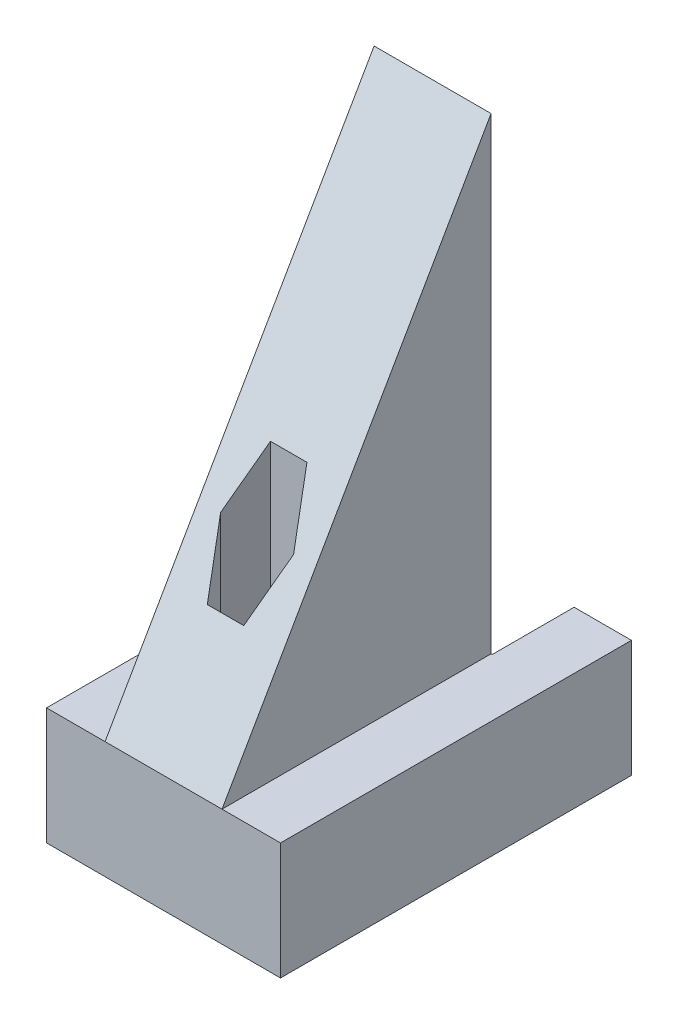
ISO-10303-21;
HEADER;
FILE_DESCRIPTION(('STEP AP214'),'2;1');
FILE_NAME('part.step','',(''),(''),'','','');
FILE_SCHEMA(('AUTOMOTIVE_DESIGN { 1 0 10303 214 1 1 1 1 }'));
ENDSEC;
DATA;
#1=APPLICATION_CONTEXT('core data for automotive mechanical design processes');
#2=APPLICATION_PROTOCOL_DEFINITION('international standard','automotive_design',2000,#1);
#3=PRODUCT_CONTEXT('',#1,'mechanical');
#4=PRODUCT('Part','Part','',(#3));
#5=PRODUCT_RELATED_PRODUCT_CATEGORY('part','',(#4));
#6=PRODUCT_DEFINITION_FORMATION('','',#4);
#7=PRODUCT_DEFINITION_CONTEXT('part definition',#1,'design');
#8=PRODUCT_DEFINITION('design','',#6,#7);
#9=PRODUCT_DEFINITION_SHAPE('','',#8);
#10=(LENGTH_UNIT() NAMED_UNIT(*) SI_UNIT(.MILLI.,.METRE.));
#11=(NAMED_UNIT(*) PLANE_ANGLE_UNIT() SI_UNIT($,.RADIAN.));
#12=(NAMED_UNIT(*) SI_UNIT($,.STERADIAN.) SOLID_ANGLE_UNIT());
#13=UNCERTAINTY_MEASURE_WITH_UNIT(LENGTH_MEASURE(1.E-05),#10,'distance_accuracy_value','');
#14=(GEOMETRIC_REPRESENTATION_CONTEXT(3) GLOBAL_UNCERTAINTY_ASSIGNED_CONTEXT((#13)) GLOBAL_UNIT_ASSIGNED_CONTEXT((#10,
#11,#12)) REPRESENTATION_CONTEXT('',''));
#15=CARTESIAN_POINT('',(0.,0.,0.));
#16=DIRECTION('',(0.,0.,1.));
#17=DIRECTION('',(1.,0.,0.));
#18=AXIS2_PLACEMENT_3D('',#15,#16,#17);
#19=CARTESIAN_POINT('',(0.,10.,0.));
#20=DIRECTION('',(0.,-1.,0.));
#21=DIRECTION('',(0.,0.,-1.));
#22=AXIS2_PLACEMENT_3D('',#19,#20,#21);
#23=PLANE('',#22);
#24=DIRECTION('',(0.,0.,-1.));
#25=VECTOR('',#24,1.);
#26=CARTESIAN_POINT('',(5.,10.,-8.));
#27=LINE('',#26,#25);
#28=CARTESIAN_POINT('',(5.,10.,15.));
#29=VERTEX_POINT('',#28);
#30=CARTESIAN_POINT('',(5.,10.,-8.));
#31=VERTEX_POINT('',#30);
#32=EDGE_CURVE('E203',#29,#31,#27,.T.);
#33=ORIENTED_EDGE('',*,*,#32,.F.);
#34=DIRECTION('',(1.,0.,0.));
#35=VECTOR('',#34,1.);
#36=CARTESIAN_POINT('',(10.,10.,15.));
#37=LINE('',#36,#35);
#38=CARTESIAN_POINT('',(10.,10.,15.));
#39=VERTEX_POINT('',#38);
#40=EDGE_CURVE('E229',#29,#39,#37,.T.);
#41=ORIENTED_EDGE('',*,*,#40,.T.);
#42=DIRECTION('',(0.,0.,-1.));
#43=VECTOR('',#42,1.);
#44=CARTESIAN_POINT('',(10.,10.,15.));
#45=LINE('',#44,#43);
#46=CARTESIAN_POINT('',(10.,10.,-15.));
#47=VERTEX_POINT('',#46);
#48=EDGE_CURVE('E232',#39,#47,#45,.T.);
#49=ORIENTED_EDGE('',*,*,#48,.T.);
#50=DIRECTION('',(-1.,0.,0.));
#51=VECTOR('',#50,1.);
#52=CARTESIAN_POINT('',(10.,10.,-15.));
#53=LINE('',#52,#51);
#54=CARTESIAN_POINT('',(5.1,10.,-15.));
#55=VERTEX_POINT('',#54);
#56=EDGE_CURVE('E234',#47,#55,#53,.T.);
#57=ORIENTED_EDGE('',*,*,#56,.T.);
#58=DIRECTION('',(0.,0.,1.));
#59=VECTOR('',#58,1.);
#60=CARTESIAN_POINT('',(5.1,10.,-8.));
#61=LINE('',#60,#59);
#62=CARTESIAN_POINT('',(5.1,10.,-8.));
#63=VERTEX_POINT('',#62);
#64=EDGE_CURVE('E236',#55,#63,#61,.T.);
#65=ORIENTED_EDGE('',*,*,#64,.T.);
#66=DIRECTION('',(-1.,0.,0.));
#67=VECTOR('',#66,1.);
#68=CARTESIAN_POINT('',(-5.1,10.,-8.));
#69=LINE('',#68,#67);
#70=EDGE_CURVE('E239',#63,#31,#69,.T.);
#71=ORIENTED_EDGE('',*,*,#70,.T.);
#72=EDGE_LOOP('',(#33,#41,#49,#57,#65,#71));
#73=FACE_BOUND('',#72,.T.);
#74=ADVANCED_FACE('F37',(#73),#23,.F.);
#75=CARTESIAN_POINT('',(-5.1,10.,-15.));
#76=DIRECTION('',(0.,0.,1.));
#77=DIRECTION('',(1.,0.,0.));
#78=AXIS2_PLACEMENT_3D('',#75,#76,#77);
#79=PLANE('',#78);
#80=DIRECTION('',(-1.,0.,0.));
#81=VECTOR('',#80,1.);
#82=CARTESIAN_POINT('',(-5.1,0.,-15.));
#83=LINE('',#82,#81);
#84=CARTESIAN_POINT('',(-5.1,0.,-15.));
#85=VERTEX_POINT('',#84);
#86=CARTESIAN_POINT('',(-10.,0.,-15.));
#87=VERTEX_POINT('',#86);
#88=EDGE_CURVE('E222',#85,#87,#83,.T.);
#89=ORIENTED_EDGE('',*,*,#88,.T.);
#90=DIRECTION('',(0.,-1.,0.));
#91=VECTOR('',#90,1.);
#92=CARTESIAN_POINT('',(-10.,10.,-15.));
#93=LINE('',#92,#91);
#94=CARTESIAN_POINT('',(-10.,10.,-15.));
#95=VERTEX_POINT('',#94);
#96=EDGE_CURVE('E279',#95,#87,#93,.T.);
#97=ORIENTED_EDGE('',*,*,#96,.F.);
#98=DIRECTION('',(-1.,0.,0.));
#99=VECTOR('',#98,1.);
#100=CARTESIAN_POINT('',(-5.1,10.,-15.));
#101=LINE('',#100,#99);
#102=CARTESIAN_POINT('',(-5.1,10.,-15.));
#103=VERTEX_POINT('',#102);
#104=EDGE_CURVE('E223',#103,#95,#101,.T.);
#105=ORIENTED_EDGE('',*,*,#104,.F.);
#106=DIRECTION('',(0.,-1.,0.));
#107=VECTOR('',#106,1.);
#108=CARTESIAN_POINT('',(-5.1,10.,-15.));
#109=LINE('',#108,#107);
#110=EDGE_CURVE('E243',#103,#85,#109,.T.);
#111=ORIENTED_EDGE('',*,*,#110,.T.);
#112=EDGE_LOOP('',(#89,#97,#105,#111));
#113=FACE_BOUND('',#112,.T.);
#114=ADVANCED_FACE('F39',(#113),#79,.F.);
#115=CARTESIAN_POINT('',(-10.,10.,15.));
#116=DIRECTION('',(1.,0.,0.));
#117=DIRECTION('',(0.,0.,-1.));
#118=AXIS2_PLACEMENT_3D('',#115,#116,#117);
#119=PLANE('',#118);
#120=DIRECTION('',(0.,0.,1.));
#121=VECTOR('',#120,1.);
#122=CARTESIAN_POINT('',(-10.,0.,15.));
#123=LINE('',#122,#121);
#124=CARTESIAN_POINT('',(-10.,0.,15.));
#125=VERTEX_POINT('',#124);
#126=EDGE_CURVE('E246',#87,#125,#123,.T.);
#127=ORIENTED_EDGE('',*,*,#126,.T.);
#128=DIRECTION('',(0.,-1.,0.));
#129=VECTOR('',#128,1.);
#130=CARTESIAN_POINT('',(-10.,10.,15.));
#131=LINE('',#130,#129);
#132=CARTESIAN_POINT('',(-10.,10.,15.));
#133=VERTEX_POINT('',#132);
#134=EDGE_CURVE('E276',#133,#125,#131,.T.);
#135=ORIENTED_EDGE('',*,*,#134,.F.);
#136=DIRECTION('',(0.,0.,1.));
#137=VECTOR('',#136,1.);
#138=CARTESIAN_POINT('',(-10.,10.,15.));
#139=LINE('',#138,#137);
#140=EDGE_CURVE('E226',#95,#133,#139,.T.);
#141=ORIENTED_EDGE('',*,*,#140,.F.);
#142=ORIENTED_EDGE('',*,*,#96,.T.);
#143=EDGE_LOOP('',(#127,#135,#141,#142));
#144=FACE_BOUND('',#143,.T.);
#145=ADVANCED_FACE('F321',(#144),#119,.F.);
#146=CARTESIAN_POINT('',(10.,10.,15.));
#147=DIRECTION('',(0.,0.,-1.));
#148=DIRECTION('',(-1.,0.,0.));
#149=AXIS2_PLACEMENT_3D('',#146,#147,#148);
#150=PLANE('',#149);
#151=DIRECTION('',(1.,0.,0.));
#152=VECTOR('',#151,1.);
#153=CARTESIAN_POINT('',(10.,0.,15.));
#154=LINE('',#153,#152);
#155=CARTESIAN_POINT('',(10.,0.,15.));
#156=VERTEX_POINT('',#155);
#157=EDGE_CURVE('E248',#125,#156,#154,.T.);
#158=ORIENTED_EDGE('',*,*,#157,.T.);
#159=DIRECTION('',(0.,-1.,0.));
#160=VECTOR('',#159,1.);
#161=CARTESIAN_POINT('',(10.,10.,15.));
#162=LINE('',#161,#160);
#163=EDGE_CURVE('E273',#39,#156,#162,.T.);
#164=ORIENTED_EDGE('',*,*,#163,.F.);
#165=ORIENTED_EDGE('',*,*,#40,.F.);
#166=DIRECTION('',(-1.,0.,0.));
#167=VECTOR('',#166,1.);
#168=CARTESIAN_POINT('',(5.,10.,15.));
#169=LINE('',#168,#167);
#170=CARTESIAN_POINT('',(-5.,10.,15.));
#171=VERTEX_POINT('',#170);
#172=EDGE_CURVE('E212',#29,#171,#169,.T.);
#173=ORIENTED_EDGE('',*,*,#172,.T.);
#174=EDGE_CURVE('E230',#133,#171,#37,.T.);
#175=ORIENTED_EDGE('',*,*,#174,.F.);
#176=ORIENTED_EDGE('',*,*,#134,.T.);
#177=EDGE_LOOP('',(#158,#164,#165,#173,#175,#176));
#178=FACE_BOUND('',#177,.T.);
#179=ADVANCED_FACE('F357',(#178),#150,.F.);
#180=CARTESIAN_POINT('',(10.,10.,15.));
#181=DIRECTION('',(-1.,0.,0.));
#182=DIRECTION('',(0.,0.,1.));
#183=AXIS2_PLACEMENT_3D('',#180,#181,#182);
#184=PLANE('',#183);
#185=DIRECTION('',(0.,0.,-1.));
#186=VECTOR('',#185,1.);
#187=CARTESIAN_POINT('',(10.,0.,15.));
#188=LINE('',#187,#186);
#189=CARTESIAN_POINT('',(10.,0.,-15.));
#190=VERTEX_POINT('',#189);
#191=EDGE_CURVE('E250',#156,#190,#188,.T.);
#192=ORIENTED_EDGE('',*,*,#191,.T.);
#193=DIRECTION('',(0.,-1.,0.));
#194=VECTOR('',#193,1.);
#195=CARTESIAN_POINT('',(10.,10.,-15.));
#196=LINE('',#195,#194);
#197=EDGE_CURVE('E270',#47,#190,#196,.T.);
#198=ORIENTED_EDGE('',*,*,#197,.F.);
#199=ORIENTED_EDGE('',*,*,#48,.F.);
#200=ORIENTED_EDGE('',*,*,#163,.T.);
#201=EDGE_LOOP('',(#192,#198,#199,#200));
#202=FACE_BOUND('',#201,.T.);
#203=ADVANCED_FACE('F365',(#202),#184,.F.);
#204=CARTESIAN_POINT('',(10.,10.,-15.));
#205=DIRECTION('',(0.,0.,1.));
#206=DIRECTION('',(1.,0.,0.));
#207=AXIS2_PLACEMENT_3D('',#204,#205,#206);
#208=PLANE('',#207);
#209=DIRECTION('',(-1.,0.,0.));
#210=VECTOR('',#209,1.);
#211=CARTESIAN_POINT('',(10.,0.,-15.));
#212=LINE('',#211,#210);
#213=CARTESIAN_POINT('',(5.1,0.,-15.));
#214=VERTEX_POINT('',#213);
#215=EDGE_CURVE('E252',#190,#214,#212,.T.);
#216=ORIENTED_EDGE('',*,*,#215,.T.);
#217=DIRECTION('',(0.,-1.,0.));
#218=VECTOR('',#217,1.);
#219=CARTESIAN_POINT('',(5.1,10.,-15.));
#220=LINE('',#219,#218);
#221=EDGE_CURVE('E267',#55,#214,#220,.T.);
#222=ORIENTED_EDGE('',*,*,#221,.F.);
#223=ORIENTED_EDGE('',*,*,#56,.F.);
#224=ORIENTED_EDGE('',*,*,#197,.T.);
#225=EDGE_LOOP('',(#216,#222,#223,#224));
#226=FACE_BOUND('',#225,.T.);
#227=ADVANCED_FACE('F369',(#226),#208,.F.);
#228=CARTESIAN_POINT('',(5.1,10.,-8.));
#229=DIRECTION('',(1.,0.,0.));
#230=DIRECTION('',(0.,0.,-1.));
#231=AXIS2_PLACEMENT_3D('',#228,#229,#230);
#232=PLANE('',#231);
#233=DIRECTION('',(0.,0.,1.));
#234=VECTOR('',#233,1.);
#235=CARTESIAN_POINT('',(5.1,0.,-8.));
#236=LINE('',#235,#234);
#237=CARTESIAN_POINT('',(5.1,0.,-8.));
#238=VERTEX_POINT('',#237);
#239=EDGE_CURVE('E254',#214,#238,#236,.T.);
#240=ORIENTED_EDGE('',*,*,#239,.T.);
#241=DIRECTION('',(0.,-1.,0.));
#242=VECTOR('',#241,1.);
#243=CARTESIAN_POINT('',(5.1,10.,-8.));
#244=LINE('',#243,#242);
#245=EDGE_CURVE('E264',#63,#238,#244,.T.);
#246=ORIENTED_EDGE('',*,*,#245,.F.);
#247=ORIENTED_EDGE('',*,*,#64,.F.);
#248=ORIENTED_EDGE('',*,*,#221,.T.);
#249=EDGE_LOOP('',(#240,#246,#247,#248));
#250=FACE_BOUND('',#249,.T.);
#251=ADVANCED_FACE('F379',(#250),#232,.F.);
#252=CARTESIAN_POINT('',(-5.1,10.,-8.));
#253=DIRECTION('',(0.,0.,1.));
#254=DIRECTION('',(1.,0.,0.));
#255=AXIS2_PLACEMENT_3D('',#252,#253,#254);
#256=PLANE('',#255);
#257=DIRECTION('',(-1.,0.,0.));
#258=VECTOR('',#257,1.);
#259=CARTESIAN_POINT('',(-5.1,0.,-8.));
#260=LINE('',#259,#258);
#261=CARTESIAN_POINT('',(-5.1,0.,-8.));
#262=VERTEX_POINT('',#261);
#263=EDGE_CURVE('E256',#238,#262,#260,.T.);
#264=ORIENTED_EDGE('',*,*,#263,.T.);
#265=DIRECTION('',(0.,-1.,0.));
#266=VECTOR('',#265,1.);
#267=CARTESIAN_POINT('',(-5.1,10.,-8.));
#268=LINE('',#267,#266);
#269=CARTESIAN_POINT('',(-5.1,10.,-8.));
#270=VERTEX_POINT('',#269);
#271=EDGE_CURVE('E261',#270,#262,#268,.T.);
#272=ORIENTED_EDGE('',*,*,#271,.F.);
#273=CARTESIAN_POINT('',(-5.,10.,-8.));
#274=VERTEX_POINT('',#273);
#275=EDGE_CURVE('E238',#274,#270,#69,.T.);
#276=ORIENTED_EDGE('',*,*,#275,.F.);
#277=DIRECTION('',(0.,1.,0.));
#278=VECTOR('',#277,1.);
#279=CARTESIAN_POINT('',(-5.,50.,-7.99999999999999));
#280=LINE('',#279,#278);
#281=CARTESIAN_POINT('',(-5.,50.,-7.99999999999999));
#282=VERTEX_POINT('',#281);
#283=EDGE_CURVE('E214',#274,#282,#280,.T.);
#284=ORIENTED_EDGE('',*,*,#283,.T.);
#285=DIRECTION('',(-1.,0.,0.));
#286=VECTOR('',#285,1.);
#287=CARTESIAN_POINT('',(5.,50.,-7.99999999999999));
#288=LINE('',#287,#286);
#289=CARTESIAN_POINT('',(5.,50.,-7.99999999999999));
#290=VERTEX_POINT('',#289);
#291=EDGE_CURVE('E219',#290,#282,#288,.T.);
#292=ORIENTED_EDGE('',*,*,#291,.F.);
#293=DIRECTION('',(0.,1.,0.));
#294=VECTOR('',#293,1.);
#295=CARTESIAN_POINT('',(5.,50.,-7.99999999999999));
#296=LINE('',#295,#294);
#297=EDGE_CURVE('E206',#31,#290,#296,.T.);
#298=ORIENTED_EDGE('',*,*,#297,.F.);
#299=ORIENTED_EDGE('',*,*,#70,.F.);
#300=ORIENTED_EDGE('',*,*,#245,.T.);
#301=EDGE_LOOP('',(#264,#272,#276,#284,#292,#298,#299,#300));
#302=FACE_BOUND('',#301,.T.);
#303=ADVANCED_FACE('F333',(#302),#256,.F.);
#304=CARTESIAN_POINT('',(-5.1,10.,-15.));
#305=DIRECTION('',(-1.,0.,0.));
#306=DIRECTION('',(0.,0.,1.));
#307=AXIS2_PLACEMENT_3D('',#304,#305,#306);
#308=PLANE('',#307);
#309=DIRECTION('',(0.,0.,-1.));
#310=VECTOR('',#309,1.);
#311=CARTESIAN_POINT('',(-5.1,0.,-15.));
#312=LINE('',#311,#310);
#313=EDGE_CURVE('E227',#262,#85,#312,.T.);
#314=ORIENTED_EDGE('',*,*,#313,.T.);
#315=ORIENTED_EDGE('',*,*,#110,.F.);
#316=DIRECTION('',(0.,0.,-1.));
#317=VECTOR('',#316,1.);
#318=CARTESIAN_POINT('',(-5.1,10.,-15.));
#319=LINE('',#318,#317);
#320=EDGE_CURVE('E241',#270,#103,#319,.T.);
#321=ORIENTED_EDGE('',*,*,#320,.F.);
#322=ORIENTED_EDGE('',*,*,#271,.T.);
#323=EDGE_LOOP('',(#314,#315,#321,#322));
#324=FACE_BOUND('',#323,.T.);
#325=ADVANCED_FACE('F327',(#324),#308,.F.);
#326=ORIENTED_EDGE('',*,*,#174,.T.);
#327=DIRECTION('',(0.,0.,-1.));
#328=VECTOR('',#327,1.);
#329=CARTESIAN_POINT('',(-5.,10.,-8.));
#330=LINE('',#329,#328);
#331=EDGE_CURVE('E60',#171,#274,#330,.T.);
#332=ORIENTED_EDGE('',*,*,#331,.T.);
#333=ORIENTED_EDGE('',*,*,#275,.T.);
#334=ORIENTED_EDGE('',*,*,#320,.T.);
#335=ORIENTED_EDGE('',*,*,#104,.T.);
#336=ORIENTED_EDGE('',*,*,#140,.T.);
#337=EDGE_LOOP('',(#326,#332,#333,#334,#335,#336));
#338=FACE_BOUND('',#337,.T.);
#339=ADVANCED_FACE('F317',(#338),#23,.F.);
#340=CARTESIAN_POINT('',(0.,0.,0.));
#341=DIRECTION('',(0.,-1.,0.));
#342=DIRECTION('',(0.,0.,-1.));
#343=AXIS2_PLACEMENT_3D('',#340,#341,#342);
#344=PLANE('',#343);
#345=CARTESIAN_POINT('',(0.,0.,7.));
#346=DIRECTION('',(0.,1.,0.));
#347=DIRECTION('',(0.,0.,1.));
#348=AXIS2_PLACEMENT_3D('',#345,#346,#347);
#349=CIRCLE('',#348,1.4);
#350=CARTESIAN_POINT('',(0.,0.,8.4));
#351=VERTEX_POINT('',#350);
#352=EDGE_CURVE('E180',#351,#351,#349,.T.);
#353=ORIENTED_EDGE('',*,*,#352,.T.);
#354=EDGE_LOOP('',(#353));
#355=FACE_BOUND('',#354,.T.);
#356=ORIENTED_EDGE('',*,*,#88,.F.);
#357=ORIENTED_EDGE('',*,*,#313,.F.);
#358=ORIENTED_EDGE('',*,*,#263,.F.);
#359=ORIENTED_EDGE('',*,*,#239,.F.);
#360=ORIENTED_EDGE('',*,*,#215,.F.);
#361=ORIENTED_EDGE('',*,*,#191,.F.);
#362=ORIENTED_EDGE('',*,*,#157,.F.);
#363=ORIENTED_EDGE('',*,*,#126,.F.);
#364=EDGE_LOOP('',(#356,#357,#358,#359,#360,#361,#362,#363));
#365=FACE_BOUND('',#364,.T.);
#366=ADVANCED_FACE('F326',(#355,#365),#344,.T.);
#367=CARTESIAN_POINT('',(5.,10.,15.));
#368=DIRECTION('',(0.,-0.498471124258083,-0.866906303057535));
#369=DIRECTION('',(0.,0.866906303057535,-0.498471124258082));
#370=AXIS2_PLACEMENT_3D('',#367,#368,#369);
#371=PLANE('',#370);
#372=DIRECTION('',(0.276566990390232,-0.833092311395296,0.479028079052295));
#373=VECTOR('',#372,1.);
#374=CARTESIAN_POINT('',(7.52718112620149,10.6305040898183,14.6374601483545));
#375=LINE('',#374,#373);
#376=CARTESIAN_POINT('',(1.55884572681199,28.6086956521739,4.3));
#377=VERTEX_POINT('',#376);
#378=CARTESIAN_POINT('',(3.11769145362398,23.9130434782609,7.));
#379=VERTEX_POINT('',#378);
#380=EDGE_CURVE('E282',#377,#379,#375,.T.);
#381=ORIENTED_EDGE('',*,*,#380,.T.);
#382=DIRECTION('',(-0.276566990390233,-0.833092311395296,0.479028079052295));
#383=VECTOR('',#382,1.);
#384=CARTESIAN_POINT('',(-1.00384529210769,11.4978938280533,14.1387110488693));
#385=LINE('',#384,#383);
#386=CARTESIAN_POINT('',(1.55884572681199,19.2173913043478,9.7));
#387=VERTEX_POINT('',#386);
#388=EDGE_CURVE('E11',#379,#387,#385,.T.);
#389=ORIENTED_EDGE('',*,*,#388,.T.);
#390=DIRECTION('',(-1.,0.,0.));
#391=VECTOR('',#390,1.);
#392=CARTESIAN_POINT('',(5.,19.2173913043478,9.7));
#393=LINE('',#392,#391);
#394=CARTESIAN_POINT('',(-1.55884572681199,19.2173913043478,9.7));
#395=VERTEX_POINT('',#394);
#396=EDGE_CURVE('E45',#387,#395,#393,.T.);
#397=ORIENTED_EDGE('',*,*,#396,.T.);
#398=DIRECTION('',(-0.276566990390232,0.833092311395296,-0.479028079052295));
#399=VECTOR('',#398,1.);
#400=CARTESIAN_POINT('',(1.76873829384279,9.19383549525494,15.4635445902284));
#401=LINE('',#400,#399);
#402=CARTESIAN_POINT('',(-3.11769145362398,23.9130434782609,7.));
#403=VERTEX_POINT('',#402);
#404=EDGE_CURVE('E290',#395,#403,#401,.T.);
#405=ORIENTED_EDGE('',*,*,#404,.T.);
#406=DIRECTION('',(0.276566990390233,0.833092311395296,-0.479028079052295));
#407=VECTOR('',#406,1.);
#408=CARTESIAN_POINT('',(-6.76228812446639,12.9345624226167,13.3126266069954));
#409=LINE('',#408,#407);
#410=CARTESIAN_POINT('',(-1.55884572681199,28.6086956521739,4.3));
#411=VERTEX_POINT('',#410);
#412=EDGE_CURVE('E287',#403,#411,#409,.T.);
#413=ORIENTED_EDGE('',*,*,#412,.T.);
#414=DIRECTION('',(1.,0.,0.));
#415=VECTOR('',#414,1.);
#416=CARTESIAN_POINT('',(5.,28.6086956521739,4.3));
#417=LINE('',#416,#415);
#418=EDGE_CURVE('E284',#411,#377,#417,.T.);
#419=ORIENTED_EDGE('',*,*,#418,.T.);
#420=EDGE_LOOP('',(#381,#389,#397,#405,#413,#419));
#421=FACE_BOUND('',#420,.T.);
#422=DIRECTION('',(0.,-0.866906303057535,0.498471124258083));
#423=VECTOR('',#422,1.);
#424=CARTESIAN_POINT('',(-5.,10.,15.));
#425=LINE('',#424,#423);
#426=EDGE_CURVE('E207',#282,#171,#425,.T.);
#427=ORIENTED_EDGE('',*,*,#426,.T.);
#428=ORIENTED_EDGE('',*,*,#172,.F.);
#429=DIRECTION('',(0.,-0.866906303057535,0.498471124258083));
#430=VECTOR('',#429,1.);
#431=CARTESIAN_POINT('',(5.,10.,15.));
#432=LINE('',#431,#430);
#433=EDGE_CURVE('E209',#290,#29,#432,.T.);
#434=ORIENTED_EDGE('',*,*,#433,.F.);
#435=ORIENTED_EDGE('',*,*,#291,.T.);
#436=EDGE_LOOP('',(#427,#428,#434,#435));
#437=FACE_BOUND('',#436,.T.);
#438=ADVANCED_FACE('F294',(#421,#437),#371,.F.);
#439=CARTESIAN_POINT('',(5.,0.,0.));
#440=DIRECTION('',(1.,0.,0.));
#441=DIRECTION('',(0.,0.,-1.));
#442=AXIS2_PLACEMENT_3D('',#439,#440,#441);
#443=PLANE('',#442);
#444=ORIENTED_EDGE('',*,*,#32,.T.);
#445=ORIENTED_EDGE('',*,*,#297,.T.);
#446=ORIENTED_EDGE('',*,*,#433,.T.);
#447=EDGE_LOOP('',(#444,#445,#446));
#448=FACE_BOUND('',#447,.T.);
#449=ADVANCED_FACE('F375',(#448),#443,.T.);
#450=CARTESIAN_POINT('',(-5.,0.,0.));
#451=DIRECTION('',(1.,0.,0.));
#452=DIRECTION('',(0.,0.,-1.));
#453=AXIS2_PLACEMENT_3D('',#450,#451,#452);
#454=PLANE('',#453);
#455=ORIENTED_EDGE('',*,*,#331,.F.);
#456=ORIENTED_EDGE('',*,*,#426,.F.);
#457=ORIENTED_EDGE('',*,*,#283,.F.);
#458=EDGE_LOOP('',(#455,#456,#457));
#459=FACE_BOUND('',#458,.T.);
#460=ADVANCED_FACE('F345',(#459),#454,.F.);
#461=CARTESIAN_POINT('',(1.55884572681199,5.,9.7));
#462=DIRECTION('',(0.866025403784438,0.,0.500000000000001));
#463=DIRECTION('',(0.500000000000001,0.,-0.866025403784438));
#464=AXIS2_PLACEMENT_3D('',#461,#462,#463);
#465=PLANE('',#464);
#466=DIRECTION('',(0.,1.,0.));
#467=VECTOR('',#466,1.);
#468=CARTESIAN_POINT('',(3.11769145362398,5.,7.));
#469=LINE('',#468,#467);
#470=CARTESIAN_POINT('',(3.11769145362398,5.,7.));
#471=VERTEX_POINT('',#470);
#472=EDGE_CURVE('E52',#471,#379,#469,.T.);
#473=ORIENTED_EDGE('',*,*,#472,.F.);
#474=DIRECTION('',(0.500000000000001,0.,-0.866025403784438));
#475=VECTOR('',#474,1.);
#476=CARTESIAN_POINT('',(1.55884572681199,5.,9.7));
#477=LINE('',#476,#475);
#478=CARTESIAN_POINT('',(1.55884572681199,5.,9.7));
#479=VERTEX_POINT('',#478);
#480=EDGE_CURVE('E159',#479,#471,#477,.T.);
#481=ORIENTED_EDGE('',*,*,#480,.F.);
#482=DIRECTION('',(0.,1.,0.));
#483=VECTOR('',#482,1.);
#484=CARTESIAN_POINT('',(1.55884572681199,5.,9.7));
#485=LINE('',#484,#483);
#486=EDGE_CURVE('E191',#479,#387,#485,.T.);
#487=ORIENTED_EDGE('',*,*,#486,.T.);
#488=ORIENTED_EDGE('',*,*,#388,.F.);
#489=EDGE_LOOP('',(#473,#481,#487,#488));
#490=FACE_BOUND('',#489,.T.);
#491=ADVANCED_FACE('F156',(#490),#465,.F.);
#492=CARTESIAN_POINT('',(-1.55884572681199,5.,9.7));
#493=DIRECTION('',(0.,0.,1.));
#494=DIRECTION('',(1.,0.,0.));
#495=AXIS2_PLACEMENT_3D('',#492,#493,#494);
#496=PLANE('',#495);
#497=ORIENTED_EDGE('',*,*,#486,.F.);
#498=DIRECTION('',(1.,0.,0.));
#499=VECTOR('',#498,1.);
#500=CARTESIAN_POINT('',(-1.55884572681199,5.,9.7));
#501=LINE('',#500,#499);
#502=CARTESIAN_POINT('',(-1.55884572681199,5.,9.7));
#503=VERTEX_POINT('',#502);
#504=EDGE_CURVE('E163',#503,#479,#501,.T.);
#505=ORIENTED_EDGE('',*,*,#504,.F.);
#506=DIRECTION('',(0.,1.,0.));
#507=VECTOR('',#506,1.);
#508=CARTESIAN_POINT('',(-1.55884572681199,5.,9.7));
#509=LINE('',#508,#507);
#510=EDGE_CURVE('E193',#503,#395,#509,.T.);
#511=ORIENTED_EDGE('',*,*,#510,.T.);
#512=ORIENTED_EDGE('',*,*,#396,.F.);
#513=EDGE_LOOP('',(#497,#505,#511,#512));
#514=FACE_BOUND('',#513,.T.);
#515=ADVANCED_FACE('F297',(#514),#496,.F.);
#516=CARTESIAN_POINT('',(-3.11769145362398,5.,7.));
#517=DIRECTION('',(-0.866025403784438,0.,0.5));
#518=DIRECTION('',(0.5,0.,0.866025403784438));
#519=AXIS2_PLACEMENT_3D('',#516,#517,#518);
#520=PLANE('',#519);
#521=ORIENTED_EDGE('',*,*,#510,.F.);
#522=DIRECTION('',(0.5,0.,0.866025403784438));
#523=VECTOR('',#522,1.);
#524=CARTESIAN_POINT('',(-3.11769145362398,5.,7.));
#525=LINE('',#524,#523);
#526=CARTESIAN_POINT('',(-3.11769145362398,5.,7.));
#527=VERTEX_POINT('',#526);
#528=EDGE_CURVE('E188',#527,#503,#525,.T.);
#529=ORIENTED_EDGE('',*,*,#528,.F.);
#530=DIRECTION('',(0.,1.,0.));
#531=VECTOR('',#530,1.);
#532=CARTESIAN_POINT('',(-3.11769145362398,5.,7.));
#533=LINE('',#532,#531);
#534=EDGE_CURVE('E196',#527,#403,#533,.T.);
#535=ORIENTED_EDGE('',*,*,#534,.T.);
#536=ORIENTED_EDGE('',*,*,#404,.F.);
#537=EDGE_LOOP('',(#521,#529,#535,#536));
#538=FACE_BOUND('',#537,.T.);
#539=ADVANCED_FACE('F300',(#538),#520,.F.);
#540=CARTESIAN_POINT('',(-1.55884572681199,5.,4.3));
#541=DIRECTION('',(-0.866025403784438,0.,-0.500000000000001));
#542=DIRECTION('',(-0.500000000000001,0.,0.866025403784438));
#543=AXIS2_PLACEMENT_3D('',#540,#541,#542);
#544=PLANE('',#543);
#545=ORIENTED_EDGE('',*,*,#534,.F.);
#546=DIRECTION('',(-0.500000000000001,0.,0.866025403784438));
#547=VECTOR('',#546,1.);
#548=CARTESIAN_POINT('',(-1.55884572681199,5.,4.3));
#549=LINE('',#548,#547);
#550=CARTESIAN_POINT('',(-1.55884572681199,5.,4.3));
#551=VERTEX_POINT('',#550);
#552=EDGE_CURVE('E185',#551,#527,#549,.T.);
#553=ORIENTED_EDGE('',*,*,#552,.F.);
#554=DIRECTION('',(0.,1.,0.));
#555=VECTOR('',#554,1.);
#556=CARTESIAN_POINT('',(-1.55884572681199,5.,4.3));
#557=LINE('',#556,#555);
#558=EDGE_CURVE('E199',#551,#411,#557,.T.);
#559=ORIENTED_EDGE('',*,*,#558,.T.);
#560=ORIENTED_EDGE('',*,*,#412,.F.);
#561=EDGE_LOOP('',(#545,#553,#559,#560));
#562=FACE_BOUND('',#561,.T.);
#563=ADVANCED_FACE('F303',(#562),#544,.F.);
#564=CARTESIAN_POINT('',(1.55884572681199,5.,4.3));
#565=DIRECTION('',(0.,0.,-1.));
#566=DIRECTION('',(-1.,0.,0.));
#567=AXIS2_PLACEMENT_3D('',#564,#565,#566);
#568=PLANE('',#567);
#569=ORIENTED_EDGE('',*,*,#558,.F.);
#570=DIRECTION('',(-1.,0.,0.));
#571=VECTOR('',#570,1.);
#572=CARTESIAN_POINT('',(1.55884572681199,5.,4.3));
#573=LINE('',#572,#571);
#574=CARTESIAN_POINT('',(1.55884572681199,5.,4.3));
#575=VERTEX_POINT('',#574);
#576=EDGE_CURVE('E172',#575,#551,#573,.T.);
#577=ORIENTED_EDGE('',*,*,#576,.F.);
#578=DIRECTION('',(0.,1.,0.));
#579=VECTOR('',#578,1.);
#580=CARTESIAN_POINT('',(1.55884572681199,5.,4.3));
#581=LINE('',#580,#579);
#582=EDGE_CURVE('E162',#575,#377,#581,.T.);
#583=ORIENTED_EDGE('',*,*,#582,.T.);
#584=ORIENTED_EDGE('',*,*,#418,.F.);
#585=EDGE_LOOP('',(#569,#577,#583,#584));
#586=FACE_BOUND('',#585,.T.);
#587=ADVANCED_FACE('F305',(#586),#568,.F.);
#588=CARTESIAN_POINT('',(3.11769145362398,5.,7.));
#589=DIRECTION('',(0.866025403784438,0.,-0.5));
#590=DIRECTION('',(-0.5,0.,-0.866025403784439));
#591=AXIS2_PLACEMENT_3D('',#588,#589,#590);
#592=PLANE('',#591);
#593=ORIENTED_EDGE('',*,*,#582,.F.);
#594=DIRECTION('',(-0.5,0.,-0.866025403784438));
#595=VECTOR('',#594,1.);
#596=CARTESIAN_POINT('',(3.11769145362398,5.,7.));
#597=LINE('',#596,#595);
#598=EDGE_CURVE('E166',#471,#575,#597,.T.);
#599=ORIENTED_EDGE('',*,*,#598,.F.);
#600=ORIENTED_EDGE('',*,*,#472,.T.);
#601=ORIENTED_EDGE('',*,*,#380,.F.);
#602=EDGE_LOOP('',(#593,#599,#600,#601));
#603=FACE_BOUND('',#602,.T.);
#604=ADVANCED_FACE('F167',(#603),#592,.F.);
#605=CARTESIAN_POINT('',(0.,5.,0.));
#606=DIRECTION('',(0.,1.,0.));
#607=DIRECTION('',(0.,0.,1.));
#608=AXIS2_PLACEMENT_3D('',#605,#606,#607);
#609=PLANE('',#608);
#610=CARTESIAN_POINT('',(0.,5.,7.));
#611=DIRECTION('',(0.,1.,0.));
#612=DIRECTION('',(0.,0.,1.));
#613=AXIS2_PLACEMENT_3D('',#610,#611,#612);
#614=CIRCLE('',#613,1.4);
#615=CARTESIAN_POINT('',(0.,5.,8.4));
#616=VERTEX_POINT('',#615);
#617=EDGE_CURVE('E177',#616,#616,#614,.T.);
#618=ORIENTED_EDGE('',*,*,#617,.F.);
#619=EDGE_LOOP('',(#618));
#620=FACE_BOUND('',#619,.T.);
#621=ORIENTED_EDGE('',*,*,#480,.T.);
#622=ORIENTED_EDGE('',*,*,#598,.T.);
#623=ORIENTED_EDGE('',*,*,#576,.T.);
#624=ORIENTED_EDGE('',*,*,#552,.T.);
#625=ORIENTED_EDGE('',*,*,#528,.T.);
#626=ORIENTED_EDGE('',*,*,#504,.T.);
#627=EDGE_LOOP('',(#621,#622,#623,#624,#625,#626));
#628=FACE_BOUND('',#627,.T.);
#629=ADVANCED_FACE('F174',(#620,#628),#609,.T.);
#630=CARTESIAN_POINT('',(0.,50.001,7.));
#631=DIRECTION('',(0.,-1.,0.));
#632=DIRECTION('',(0.,0.,-1.));
#633=AXIS2_PLACEMENT_3D('',#630,#631,#632);
#634=CYLINDRICAL_SURFACE('',#633,1.4);
#635=ORIENTED_EDGE('',*,*,#617,.T.);
#636=EDGE_LOOP('',(#635));
#637=FACE_BOUND('',#636,.T.);
#638=ORIENTED_EDGE('',*,*,#352,.F.);
#639=EDGE_LOOP('',(#638));
#640=FACE_BOUND('',#639,.T.);
#641=ADVANCED_FACE('F509',(#637,#640),#634,.F.);
#642=CLOSED_SHELL('',(#74,#114,#145,#179,#203,#227,#251,#303,#325,#339,#366,#438,#449,#460,#491,
#515,#539,#563,#587,#604,#629,#641));
#643=MANIFOLD_SOLID_BREP('B2',#642);
#644=ADVANCED_BREP_SHAPE_REPRESENTATION('',(#18,#643),#14);
#645=SHAPE_DEFINITION_REPRESENTATION(#9,#644);
ENDSEC;
END-ISO-10303-21;
